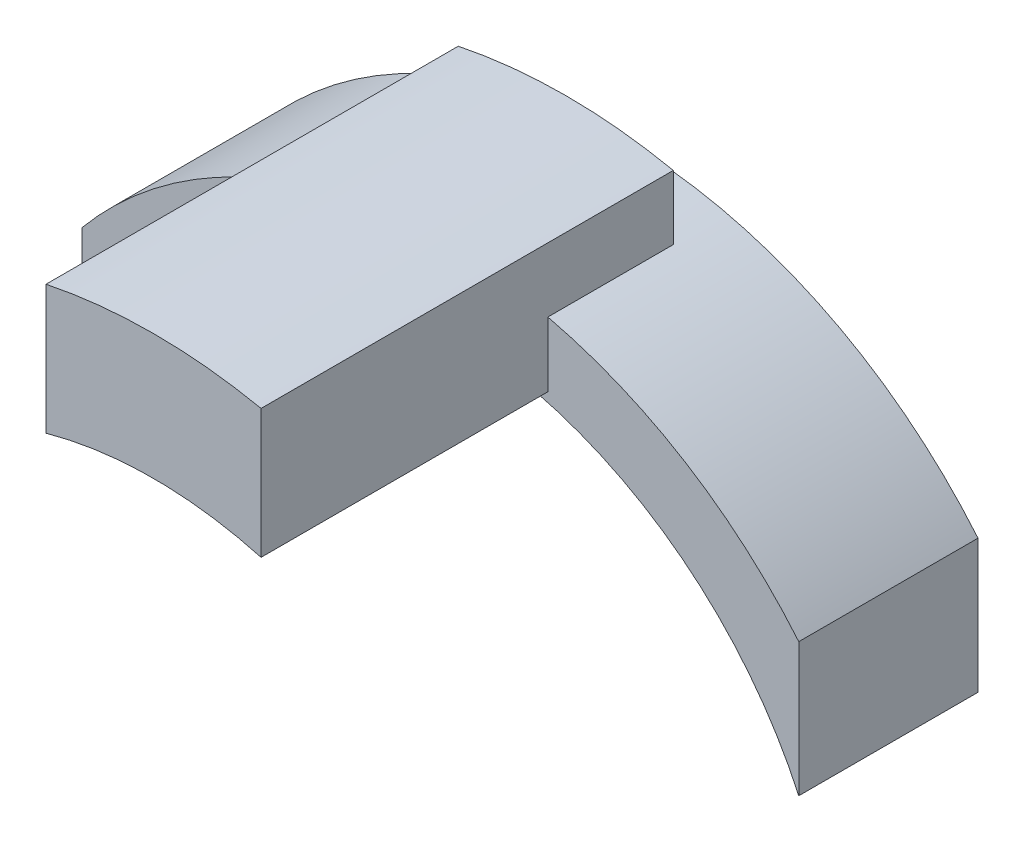
ISO-10303-21;
HEADER;
FILE_DESCRIPTION(('STEP AP214'),'2;1');
FILE_NAME('part.step','',(''),(''),'','','');
FILE_SCHEMA(('AUTOMOTIVE_DESIGN { 1 0 10303 214 1 1 1 1 }'));
ENDSEC;
DATA;
#1=APPLICATION_CONTEXT('core data for automotive mechanical design processes');
#2=APPLICATION_PROTOCOL_DEFINITION('international standard','automotive_design',2000,#1);
#3=PRODUCT_CONTEXT('',#1,'mechanical');
#4=PRODUCT('Part','Part','',(#3));
#5=PRODUCT_RELATED_PRODUCT_CATEGORY('part','',(#4));
#6=PRODUCT_DEFINITION_FORMATION('','',#4);
#7=PRODUCT_DEFINITION_CONTEXT('part definition',#1,'design');
#8=PRODUCT_DEFINITION('design','',#6,#7);
#9=PRODUCT_DEFINITION_SHAPE('','',#8);
#10=(LENGTH_UNIT() NAMED_UNIT(*) SI_UNIT(.MILLI.,.METRE.));
#11=(NAMED_UNIT(*) PLANE_ANGLE_UNIT() SI_UNIT($,.RADIAN.));
#12=(NAMED_UNIT(*) SI_UNIT($,.STERADIAN.) SOLID_ANGLE_UNIT());
#13=UNCERTAINTY_MEASURE_WITH_UNIT(LENGTH_MEASURE(1.E-05),#10,'distance_accuracy_value','');
#14=(GEOMETRIC_REPRESENTATION_CONTEXT(3) GLOBAL_UNCERTAINTY_ASSIGNED_CONTEXT((#13)) GLOBAL_UNIT_ASSIGNED_CONTEXT((#10,
#11,#12)) REPRESENTATION_CONTEXT('',''));
#15=CARTESIAN_POINT('',(0.,0.,0.));
#16=DIRECTION('',(0.,0.,1.));
#17=DIRECTION('',(1.,0.,0.));
#18=AXIS2_PLACEMENT_3D('',#15,#16,#17);
#19=CARTESIAN_POINT('',(0.,0.,5.));
#20=DIRECTION('',(0.,0.,-1.));
#21=DIRECTION('',(-1.,0.,0.));
#22=AXIS2_PLACEMENT_3D('',#19,#20,#21);
#23=CYLINDRICAL_SURFACE('',#22,26.);
#24=DIRECTION('',(0.,0.,-1.));
#25=VECTOR('',#24,1.);
#26=CARTESIAN_POINT('',(-6.00000000000002,25.298221281347,5.));
#27=LINE('',#26,#25);
#28=CARTESIAN_POINT('',(-6.00000000000002,25.298221281347,-2.));
#29=VERTEX_POINT('',#28);
#30=CARTESIAN_POINT('',(-6.00000000000002,25.298221281347,5.));
#31=VERTEX_POINT('',#30);
#32=EDGE_CURVE('E188',#29,#31,#27,.F.);
#33=ORIENTED_EDGE('',*,*,#32,.F.);
#34=CARTESIAN_POINT('',(0.,0.,-2.));
#35=DIRECTION('',(0.,0.,-1.));
#36=DIRECTION('',(-1.,0.,0.));
#37=AXIS2_PLACEMENT_3D('',#34,#35,#36);
#38=CIRCLE('',#37,26.);
#39=CARTESIAN_POINT('',(5.99999999999998,25.298221281347,-2.));
#40=VERTEX_POINT('',#39);
#41=EDGE_CURVE('E11',#29,#40,#38,.T.);
#42=ORIENTED_EDGE('',*,*,#41,.T.);
#43=DIRECTION('',(0.,0.,-1.));
#44=VECTOR('',#43,1.);
#45=CARTESIAN_POINT('',(5.99999999999998,25.298221281347,5.));
#46=LINE('',#45,#44);
#47=CARTESIAN_POINT('',(5.99999999999998,25.298221281347,5.));
#48=VERTEX_POINT('',#47);
#49=EDGE_CURVE('E147',#48,#40,#46,.T.);
#50=ORIENTED_EDGE('',*,*,#49,.F.);
#51=CARTESIAN_POINT('',(0.,0.,5.));
#52=DIRECTION('',(0.,0.,1.));
#53=DIRECTION('',(1.,0.,0.));
#54=AXIS2_PLACEMENT_3D('',#51,#52,#53);
#55=CIRCLE('',#54,26.);
#56=CARTESIAN_POINT('',(20.,16.6132477258361,5.));
#57=VERTEX_POINT('',#56);
#58=EDGE_CURVE('E198',#57,#48,#55,.T.);
#59=ORIENTED_EDGE('',*,*,#58,.F.);
#60=DIRECTION('',(0.,0.,-1.));
#61=VECTOR('',#60,1.);
#62=CARTESIAN_POINT('',(20.,16.6132477258361,5.));
#63=LINE('',#62,#61);
#64=CARTESIAN_POINT('',(20.,16.6132477258361,-5.));
#65=VERTEX_POINT('',#64);
#66=EDGE_CURVE('E221',#57,#65,#63,.T.);
#67=ORIENTED_EDGE('',*,*,#66,.T.);
#68=CARTESIAN_POINT('',(0.,0.,-5.));
#69=DIRECTION('',(0.,0.,1.));
#70=DIRECTION('',(1.,0.,0.));
#71=AXIS2_PLACEMENT_3D('',#68,#69,#70);
#72=CIRCLE('',#71,26.);
#73=CARTESIAN_POINT('',(-20.,16.6132477258361,-5.));
#74=VERTEX_POINT('',#73);
#75=EDGE_CURVE('E211',#65,#74,#72,.T.);
#76=ORIENTED_EDGE('',*,*,#75,.T.);
#77=DIRECTION('',(0.,0.,-1.));
#78=VECTOR('',#77,1.);
#79=CARTESIAN_POINT('',(-20.,16.6132477258361,5.));
#80=LINE('',#79,#78);
#81=CARTESIAN_POINT('',(-20.,16.6132477258361,5.));
#82=VERTEX_POINT('',#81);
#83=EDGE_CURVE('E218',#82,#74,#80,.T.);
#84=ORIENTED_EDGE('',*,*,#83,.F.);
#85=EDGE_CURVE('E197',#31,#82,#55,.T.);
#86=ORIENTED_EDGE('',*,*,#85,.F.);
#87=EDGE_LOOP('',(#33,#42,#50,#59,#67,#76,#84,#86));
#88=FACE_BOUND('',#87,.T.);
#89=ADVANCED_FACE('F47',(#88),#23,.T.);
#90=CARTESIAN_POINT('',(0.,0.,5.));
#91=DIRECTION('',(0.,0.,1.));
#92=DIRECTION('',(1.,0.,0.));
#93=AXIS2_PLACEMENT_3D('',#90,#91,#92);
#94=PLANE('',#93);
#95=CARTESIAN_POINT('',(0.,0.,5.));
#96=DIRECTION('',(0.,0.,1.));
#97=DIRECTION('',(1.,0.,0.));
#98=AXIS2_PLACEMENT_3D('',#95,#96,#97);
#99=CIRCLE('',#98,22.5);
#100=CARTESIAN_POINT('',(5.99999999999998,21.6852484422014,5.));
#101=VERTEX_POINT('',#100);
#102=CARTESIAN_POINT('',(-6.00000000000002,21.6852484422014,5.));
#103=VERTEX_POINT('',#102);
#104=EDGE_CURVE('E232',#101,#103,#99,.T.);
#105=ORIENTED_EDGE('',*,*,#104,.T.);
#106=DIRECTION('',(0.,1.,0.));
#107=VECTOR('',#106,1.);
#108=CARTESIAN_POINT('',(-6.00000000000002,0.,5.));
#109=LINE('',#108,#107);
#110=EDGE_CURVE('E57',#103,#31,#109,.T.);
#111=ORIENTED_EDGE('',*,*,#110,.T.);
#112=ORIENTED_EDGE('',*,*,#85,.T.);
#113=DIRECTION('',(0.,-1.,0.));
#114=VECTOR('',#113,1.);
#115=CARTESIAN_POINT('',(-20.,9.16515138991168,5.));
#116=LINE('',#115,#114);
#117=CARTESIAN_POINT('',(-20.,9.16515138991168,5.));
#118=VERTEX_POINT('',#117);
#119=EDGE_CURVE('E73',#82,#118,#116,.T.);
#120=ORIENTED_EDGE('',*,*,#119,.T.);
#121=CARTESIAN_POINT('',(0.,0.,5.));
#122=DIRECTION('',(0.,0.,-1.));
#123=DIRECTION('',(1.,0.,0.));
#124=AXIS2_PLACEMENT_3D('',#121,#122,#123);
#125=CIRCLE('',#124,22.);
#126=CARTESIAN_POINT('',(20.,9.16515138991168,5.));
#127=VERTEX_POINT('',#126);
#128=EDGE_CURVE('E192',#118,#127,#125,.T.);
#129=ORIENTED_EDGE('',*,*,#128,.T.);
#130=DIRECTION('',(0.,1.,0.));
#131=VECTOR('',#130,1.);
#132=CARTESIAN_POINT('',(20.,16.6132477258361,5.));
#133=LINE('',#132,#131);
#134=EDGE_CURVE('E102',#127,#57,#133,.T.);
#135=ORIENTED_EDGE('',*,*,#134,.T.);
#136=ORIENTED_EDGE('',*,*,#58,.T.);
#137=DIRECTION('',(0.,-1.,0.));
#138=VECTOR('',#137,1.);
#139=CARTESIAN_POINT('',(5.99999999999998,0.,5.));
#140=LINE('',#139,#138);
#141=EDGE_CURVE('E228',#48,#101,#140,.T.);
#142=ORIENTED_EDGE('',*,*,#141,.T.);
#143=EDGE_LOOP('',(#105,#111,#112,#120,#129,#135,#136,#142));
#144=FACE_BOUND('',#143,.T.);
#145=ADVANCED_FACE('F236',(#144),#94,.T.);
#146=CARTESIAN_POINT('',(0.,0.,5.));
#147=DIRECTION('',(0.,0.,-1.));
#148=DIRECTION('',(-1.,0.,0.));
#149=AXIS2_PLACEMENT_3D('',#146,#147,#148);
#150=CYLINDRICAL_SURFACE('',#149,22.);
#151=CARTESIAN_POINT('',(0.,0.,-5.));
#152=DIRECTION('',(0.,0.,-1.));
#153=DIRECTION('',(1.,0.,0.));
#154=AXIS2_PLACEMENT_3D('',#151,#152,#153);
#155=CIRCLE('',#154,22.);
#156=CARTESIAN_POINT('',(-20.,9.16515138991168,-5.));
#157=VERTEX_POINT('',#156);
#158=CARTESIAN_POINT('',(20.,9.16515138991168,-5.));
#159=VERTEX_POINT('',#158);
#160=EDGE_CURVE('E191',#157,#159,#155,.T.);
#161=ORIENTED_EDGE('',*,*,#160,.T.);
#162=DIRECTION('',(0.,0.,-1.));
#163=VECTOR('',#162,1.);
#164=CARTESIAN_POINT('',(20.,9.16515138991168,5.));
#165=LINE('',#164,#163);
#166=EDGE_CURVE('E225',#127,#159,#165,.T.);
#167=ORIENTED_EDGE('',*,*,#166,.F.);
#168=ORIENTED_EDGE('',*,*,#128,.F.);
#169=DIRECTION('',(0.,0.,-1.));
#170=VECTOR('',#169,1.);
#171=CARTESIAN_POINT('',(-20.,9.16515138991168,5.));
#172=LINE('',#171,#170);
#173=EDGE_CURVE('E204',#118,#157,#172,.T.);
#174=ORIENTED_EDGE('',*,*,#173,.T.);
#175=EDGE_LOOP('',(#161,#167,#168,#174));
#176=FACE_BOUND('',#175,.T.);
#177=ADVANCED_FACE('F50',(#176),#150,.F.);
#178=CARTESIAN_POINT('',(20.,16.6132477258361,5.));
#179=DIRECTION('',(-1.,0.,0.));
#180=DIRECTION('',(0.,-1.,0.));
#181=AXIS2_PLACEMENT_3D('',#178,#179,#180);
#182=PLANE('',#181);
#183=DIRECTION('',(0.,1.,0.));
#184=VECTOR('',#183,1.);
#185=CARTESIAN_POINT('',(20.,16.6132477258361,-5.));
#186=LINE('',#185,#184);
#187=EDGE_CURVE('E208',#159,#65,#186,.T.);
#188=ORIENTED_EDGE('',*,*,#187,.T.);
#189=ORIENTED_EDGE('',*,*,#66,.F.);
#190=ORIENTED_EDGE('',*,*,#134,.F.);
#191=ORIENTED_EDGE('',*,*,#166,.T.);
#192=EDGE_LOOP('',(#188,#189,#190,#191));
#193=FACE_BOUND('',#192,.T.);
#194=ADVANCED_FACE('F248',(#193),#182,.F.);
#195=CARTESIAN_POINT('',(-20.,9.16515138991168,5.));
#196=DIRECTION('',(1.,0.,0.));
#197=DIRECTION('',(0.,1.,0.));
#198=AXIS2_PLACEMENT_3D('',#195,#196,#197);
#199=PLANE('',#198);
#200=DIRECTION('',(0.,-1.,0.));
#201=VECTOR('',#200,1.);
#202=CARTESIAN_POINT('',(-20.,9.16515138991168,-5.));
#203=LINE('',#202,#201);
#204=EDGE_CURVE('E94',#74,#157,#203,.T.);
#205=ORIENTED_EDGE('',*,*,#204,.T.);
#206=ORIENTED_EDGE('',*,*,#173,.F.);
#207=ORIENTED_EDGE('',*,*,#119,.F.);
#208=ORIENTED_EDGE('',*,*,#83,.T.);
#209=EDGE_LOOP('',(#205,#206,#207,#208));
#210=FACE_BOUND('',#209,.T.);
#211=ADVANCED_FACE('F242',(#210),#199,.F.);
#212=CARTESIAN_POINT('',(0.,0.,-5.));
#213=DIRECTION('',(0.,0.,1.));
#214=DIRECTION('',(1.,0.,0.));
#215=AXIS2_PLACEMENT_3D('',#212,#213,#214);
#216=PLANE('',#215);
#217=ORIENTED_EDGE('',*,*,#160,.F.);
#218=ORIENTED_EDGE('',*,*,#204,.F.);
#219=ORIENTED_EDGE('',*,*,#75,.F.);
#220=ORIENTED_EDGE('',*,*,#187,.F.);
#221=EDGE_LOOP('',(#217,#218,#219,#220));
#222=FACE_BOUND('',#221,.T.);
#223=ADVANCED_FACE('F286',(#222),#216,.F.);
#224=CARTESIAN_POINT('',(0.,0.,-2.));
#225=DIRECTION('',(0.,0.,-1.));
#226=DIRECTION('',(-1.,0.,0.));
#227=AXIS2_PLACEMENT_3D('',#224,#225,#226);
#228=PLANE('',#227);
#229=ORIENTED_EDGE('',*,*,#41,.F.);
#230=DIRECTION('',(0.,1.,0.));
#231=VECTOR('',#230,1.);
#232=CARTESIAN_POINT('',(-6.00000000000002,21.6852484422014,-2.));
#233=LINE('',#232,#231);
#234=CARTESIAN_POINT('',(-6.00000000000002,28.8833862280724,-2.));
#235=VERTEX_POINT('',#234);
#236=EDGE_CURVE('E169',#29,#235,#233,.T.);
#237=ORIENTED_EDGE('',*,*,#236,.T.);
#238=CARTESIAN_POINT('',(0.,0.,-2.));
#239=DIRECTION('',(0.,0.,-1.));
#240=DIRECTION('',(-1.,0.,0.));
#241=AXIS2_PLACEMENT_3D('',#238,#239,#240);
#242=CIRCLE('',#241,29.5);
#243=CARTESIAN_POINT('',(5.99999999999998,28.8833862280724,-2.));
#244=VERTEX_POINT('',#243);
#245=EDGE_CURVE('E172',#235,#244,#242,.T.);
#246=ORIENTED_EDGE('',*,*,#245,.T.);
#247=DIRECTION('',(0.,-1.,0.));
#248=VECTOR('',#247,1.);
#249=CARTESIAN_POINT('',(5.99999999999998,28.8833862280724,-2.));
#250=LINE('',#249,#248);
#251=EDGE_CURVE('E175',#244,#40,#250,.T.);
#252=ORIENTED_EDGE('',*,*,#251,.T.);
#253=EDGE_LOOP('',(#229,#237,#246,#252));
#254=FACE_BOUND('',#253,.T.);
#255=ADVANCED_FACE('F253',(#254),#228,.T.);
#256=CARTESIAN_POINT('',(-6.00000000000002,21.6852484422014,-2.));
#257=DIRECTION('',(1.,0.,0.));
#258=DIRECTION('',(0.,0.,-1.));
#259=AXIS2_PLACEMENT_3D('',#256,#257,#258);
#260=PLANE('',#259);
#261=ORIENTED_EDGE('',*,*,#236,.F.);
#262=ORIENTED_EDGE('',*,*,#32,.T.);
#263=ORIENTED_EDGE('',*,*,#110,.F.);
#264=DIRECTION('',(0.,0.,1.));
#265=VECTOR('',#264,1.);
#266=CARTESIAN_POINT('',(-6.00000000000002,21.6852484422014,-2.));
#267=LINE('',#266,#265);
#268=CARTESIAN_POINT('',(-6.00000000000002,21.6852484422014,21.));
#269=VERTEX_POINT('',#268);
#270=EDGE_CURVE('E136',#103,#269,#267,.T.);
#271=ORIENTED_EDGE('',*,*,#270,.T.);
#272=DIRECTION('',(0.,1.,0.));
#273=VECTOR('',#272,1.);
#274=CARTESIAN_POINT('',(-6.00000000000002,21.6852484422014,21.));
#275=LINE('',#274,#273);
#276=CARTESIAN_POINT('',(-6.00000000000002,28.8833862280724,21.));
#277=VERTEX_POINT('',#276);
#278=EDGE_CURVE('E141',#269,#277,#275,.T.);
#279=ORIENTED_EDGE('',*,*,#278,.T.);
#280=DIRECTION('',(0.,0.,1.));
#281=VECTOR('',#280,1.);
#282=CARTESIAN_POINT('',(-6.00000000000002,28.8833862280724,-2.));
#283=LINE('',#282,#281);
#284=EDGE_CURVE('E148',#235,#277,#283,.T.);
#285=ORIENTED_EDGE('',*,*,#284,.F.);
#286=EDGE_LOOP('',(#261,#262,#263,#271,#279,#285));
#287=FACE_BOUND('',#286,.T.);
#288=ADVANCED_FACE('F139',(#287),#260,.F.);
#289=CARTESIAN_POINT('',(5.99999999999998,28.8833862280724,-2.));
#290=DIRECTION('',(-1.,0.,0.));
#291=DIRECTION('',(0.,0.,1.));
#292=AXIS2_PLACEMENT_3D('',#289,#290,#291);
#293=PLANE('',#292);
#294=ORIENTED_EDGE('',*,*,#141,.F.);
#295=ORIENTED_EDGE('',*,*,#49,.T.);
#296=ORIENTED_EDGE('',*,*,#251,.F.);
#297=DIRECTION('',(0.,0.,1.));
#298=VECTOR('',#297,1.);
#299=CARTESIAN_POINT('',(5.99999999999998,28.8833862280724,-2.));
#300=LINE('',#299,#298);
#301=CARTESIAN_POINT('',(5.99999999999998,28.8833862280724,21.));
#302=VERTEX_POINT('',#301);
#303=EDGE_CURVE('E181',#244,#302,#300,.T.);
#304=ORIENTED_EDGE('',*,*,#303,.T.);
#305=DIRECTION('',(0.,-1.,0.));
#306=VECTOR('',#305,1.);
#307=CARTESIAN_POINT('',(5.99999999999998,28.8833862280724,21.));
#308=LINE('',#307,#306);
#309=CARTESIAN_POINT('',(5.99999999999998,21.6852484422014,21.));
#310=VERTEX_POINT('',#309);
#311=EDGE_CURVE('E166',#302,#310,#308,.T.);
#312=ORIENTED_EDGE('',*,*,#311,.T.);
#313=DIRECTION('',(0.,0.,1.));
#314=VECTOR('',#313,1.);
#315=CARTESIAN_POINT('',(5.99999999999998,21.6852484422014,-2.));
#316=LINE('',#315,#314);
#317=EDGE_CURVE('E64',#101,#310,#316,.T.);
#318=ORIENTED_EDGE('',*,*,#317,.F.);
#319=EDGE_LOOP('',(#294,#295,#296,#304,#312,#318));
#320=FACE_BOUND('',#319,.T.);
#321=ADVANCED_FACE('F251',(#320),#293,.F.);
#322=CARTESIAN_POINT('',(0.,0.,-2.));
#323=DIRECTION('',(0.,0.,1.));
#324=DIRECTION('',(1.,0.,0.));
#325=AXIS2_PLACEMENT_3D('',#322,#323,#324);
#326=CYLINDRICAL_SURFACE('',#325,22.5);
#327=ORIENTED_EDGE('',*,*,#104,.F.);
#328=ORIENTED_EDGE('',*,*,#317,.T.);
#329=CARTESIAN_POINT('',(0.,0.,21.));
#330=DIRECTION('',(0.,0.,1.));
#331=DIRECTION('',(-1.,0.,0.));
#332=AXIS2_PLACEMENT_3D('',#329,#330,#331);
#333=CIRCLE('',#332,22.5);
#334=EDGE_CURVE('E155',#310,#269,#333,.T.);
#335=ORIENTED_EDGE('',*,*,#334,.T.);
#336=ORIENTED_EDGE('',*,*,#270,.F.);
#337=EDGE_LOOP('',(#327,#328,#335,#336));
#338=FACE_BOUND('',#337,.T.);
#339=ADVANCED_FACE('F160',(#338),#326,.F.);
#340=CARTESIAN_POINT('',(0.,0.,-2.));
#341=DIRECTION('',(0.,0.,1.));
#342=DIRECTION('',(1.,0.,0.));
#343=AXIS2_PLACEMENT_3D('',#340,#341,#342);
#344=CYLINDRICAL_SURFACE('',#343,29.5);
#345=ORIENTED_EDGE('',*,*,#284,.T.);
#346=CARTESIAN_POINT('',(0.,0.,21.));
#347=DIRECTION('',(0.,0.,-1.));
#348=DIRECTION('',(-1.,0.,0.));
#349=AXIS2_PLACEMENT_3D('',#346,#347,#348);
#350=CIRCLE('',#349,29.5);
#351=EDGE_CURVE('E157',#277,#302,#350,.T.);
#352=ORIENTED_EDGE('',*,*,#351,.T.);
#353=ORIENTED_EDGE('',*,*,#303,.F.);
#354=ORIENTED_EDGE('',*,*,#245,.F.);
#355=EDGE_LOOP('',(#345,#352,#353,#354));
#356=FACE_BOUND('',#355,.T.);
#357=ADVANCED_FACE('F257',(#356),#344,.T.);
#358=CARTESIAN_POINT('',(0.,0.,21.));
#359=DIRECTION('',(0.,0.,-1.));
#360=DIRECTION('',(-1.,0.,0.));
#361=AXIS2_PLACEMENT_3D('',#358,#359,#360);
#362=PLANE('',#361);
#363=ORIENTED_EDGE('',*,*,#334,.F.);
#364=ORIENTED_EDGE('',*,*,#311,.F.);
#365=ORIENTED_EDGE('',*,*,#351,.F.);
#366=ORIENTED_EDGE('',*,*,#278,.F.);
#367=EDGE_LOOP('',(#363,#364,#365,#366));
#368=FACE_BOUND('',#367,.T.);
#369=ADVANCED_FACE('F153',(#368),#362,.F.);
#370=CLOSED_SHELL('',(#89,#145,#177,#194,#211,#223,#255,#288,#321,#339,#357,#369));
#371=MANIFOLD_SOLID_BREP('B2',#370);
#372=ADVANCED_BREP_SHAPE_REPRESENTATION('',(#18,#371),#14);
#373=SHAPE_DEFINITION_REPRESENTATION(#9,#372);
ENDSEC;
END-ISO-10303-21;
